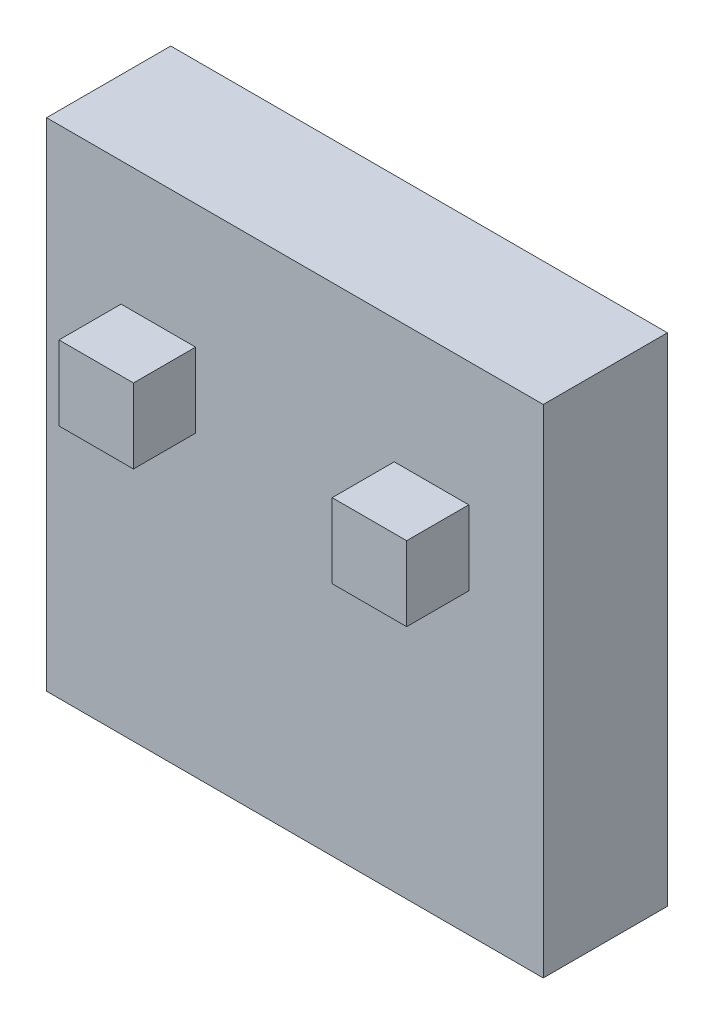
ISO-10303-21;
HEADER;
FILE_DESCRIPTION(('STEP AP214'),'2;1');
FILE_NAME('part.step','',(''),(''),'','','');
FILE_SCHEMA(('AUTOMOTIVE_DESIGN { 1 0 10303 214 1 1 1 1 }'));
ENDSEC;
DATA;
#1=APPLICATION_CONTEXT('core data for automotive mechanical design processes');
#2=APPLICATION_PROTOCOL_DEFINITION('international standard','automotive_design',2000,#1);
#3=PRODUCT_CONTEXT('',#1,'mechanical');
#4=PRODUCT('Part','Part','',(#3));
#5=PRODUCT_RELATED_PRODUCT_CATEGORY('part','',(#4));
#6=PRODUCT_DEFINITION_FORMATION('','',#4);
#7=PRODUCT_DEFINITION_CONTEXT('part definition',#1,'design');
#8=PRODUCT_DEFINITION('design','',#6,#7);
#9=PRODUCT_DEFINITION_SHAPE('','',#8);
#10=(LENGTH_UNIT() NAMED_UNIT(*) SI_UNIT(.MILLI.,.METRE.));
#11=(NAMED_UNIT(*) PLANE_ANGLE_UNIT() SI_UNIT($,.RADIAN.));
#12=(NAMED_UNIT(*) SI_UNIT($,.STERADIAN.) SOLID_ANGLE_UNIT());
#13=UNCERTAINTY_MEASURE_WITH_UNIT(LENGTH_MEASURE(1.E-05),#10,'distance_accuracy_value','');
#14=(GEOMETRIC_REPRESENTATION_CONTEXT(3) GLOBAL_UNCERTAINTY_ASSIGNED_CONTEXT((#13)) GLOBAL_UNIT_ASSIGNED_CONTEXT((#10,
#11,#12)) REPRESENTATION_CONTEXT('',''));
#15=CARTESIAN_POINT('',(0.,0.,0.));
#16=DIRECTION('',(0.,0.,1.));
#17=DIRECTION('',(1.,0.,0.));
#18=AXIS2_PLACEMENT_3D('',#15,#16,#17);
#19=CARTESIAN_POINT('',(0.,0.,10.));
#20=DIRECTION('',(0.,0.,-1.));
#21=DIRECTION('',(-1.,0.,0.));
#22=AXIS2_PLACEMENT_3D('',#19,#20,#21);
#23=PLANE('',#22);
#24=DIRECTION('',(1.,0.,0.));
#25=VECTOR('',#24,1.);
#26=CARTESIAN_POINT('',(14.,30.,10.));
#27=LINE('',#26,#25);
#28=CARTESIAN_POINT('',(8.,30.,10.));
#29=VERTEX_POINT('',#28);
#30=CARTESIAN_POINT('',(14.,30.,10.));
#31=VERTEX_POINT('',#30);
#32=EDGE_CURVE('E203',#29,#31,#27,.T.);
#33=ORIENTED_EDGE('',*,*,#32,.T.);
#34=DIRECTION('',(0.,-1.,0.));
#35=VECTOR('',#34,1.);
#36=CARTESIAN_POINT('',(14.,24.,10.));
#37=LINE('',#36,#35);
#38=CARTESIAN_POINT('',(14.,24.,10.));
#39=VERTEX_POINT('',#38);
#40=EDGE_CURVE('E178',#31,#39,#37,.T.);
#41=ORIENTED_EDGE('',*,*,#40,.T.);
#42=DIRECTION('',(-1.,0.,0.));
#43=VECTOR('',#42,1.);
#44=CARTESIAN_POINT('',(14.,24.,10.));
#45=LINE('',#44,#43);
#46=CARTESIAN_POINT('',(8.,24.,10.));
#47=VERTEX_POINT('',#46);
#48=EDGE_CURVE('E193',#39,#47,#45,.T.);
#49=ORIENTED_EDGE('',*,*,#48,.T.);
#50=DIRECTION('',(0.,1.,0.));
#51=VECTOR('',#50,1.);
#52=CARTESIAN_POINT('',(8.,24.,10.));
#53=LINE('',#52,#51);
#54=EDGE_CURVE('E50',#47,#29,#53,.T.);
#55=ORIENTED_EDGE('',*,*,#54,.T.);
#56=EDGE_LOOP('',(#33,#41,#49,#55));
#57=FACE_BOUND('',#56,.T.);
#58=DIRECTION('',(0.,-1.,0.));
#59=VECTOR('',#58,1.);
#60=CARTESIAN_POINT('',(-20.,0.,10.));
#61=LINE('',#60,#59);
#62=CARTESIAN_POINT('',(-20.,40.,10.));
#63=VERTEX_POINT('',#62);
#64=CARTESIAN_POINT('',(-20.,0.,10.));
#65=VERTEX_POINT('',#64);
#66=EDGE_CURVE('E307',#63,#65,#61,.T.);
#67=ORIENTED_EDGE('',*,*,#66,.T.);
#68=DIRECTION('',(1.,0.,0.));
#69=VECTOR('',#68,1.);
#70=CARTESIAN_POINT('',(-20.,0.,10.));
#71=LINE('',#70,#69);
#72=CARTESIAN_POINT('',(20.,0.,10.));
#73=VERTEX_POINT('',#72);
#74=EDGE_CURVE('E310',#65,#73,#71,.T.);
#75=ORIENTED_EDGE('',*,*,#74,.T.);
#76=DIRECTION('',(0.,1.,0.));
#77=VECTOR('',#76,1.);
#78=CARTESIAN_POINT('',(20.,0.,10.));
#79=LINE('',#78,#77);
#80=CARTESIAN_POINT('',(20.,40.,10.));
#81=VERTEX_POINT('',#80);
#82=EDGE_CURVE('E313',#73,#81,#79,.T.);
#83=ORIENTED_EDGE('',*,*,#82,.T.);
#84=DIRECTION('',(-1.,0.,0.));
#85=VECTOR('',#84,1.);
#86=CARTESIAN_POINT('',(-20.,40.,10.));
#87=LINE('',#86,#85);
#88=EDGE_CURVE('E315',#81,#63,#87,.T.);
#89=ORIENTED_EDGE('',*,*,#88,.T.);
#90=EDGE_LOOP('',(#67,#75,#83,#89));
#91=FACE_BOUND('',#90,.T.);
#92=DIRECTION('',(0.,-1.,0.));
#93=VECTOR('',#92,1.);
#94=CARTESIAN_POINT('',(-14.,24.,10.));
#95=LINE('',#94,#93);
#96=CARTESIAN_POINT('',(-14.,30.,10.));
#97=VERTEX_POINT('',#96);
#98=CARTESIAN_POINT('',(-14.,24.,10.));
#99=VERTEX_POINT('',#98);
#100=EDGE_CURVE('E242',#97,#99,#95,.T.);
#101=ORIENTED_EDGE('',*,*,#100,.F.);
#102=DIRECTION('',(-1.,0.,0.));
#103=VECTOR('',#102,1.);
#104=CARTESIAN_POINT('',(-14.,30.,10.));
#105=LINE('',#104,#103);
#106=CARTESIAN_POINT('',(-8.,30.,10.));
#107=VERTEX_POINT('',#106);
#108=EDGE_CURVE('E247',#107,#97,#105,.T.);
#109=ORIENTED_EDGE('',*,*,#108,.F.);
#110=DIRECTION('',(0.,1.,0.));
#111=VECTOR('',#110,1.);
#112=CARTESIAN_POINT('',(-8.,24.,10.));
#113=LINE('',#112,#111);
#114=CARTESIAN_POINT('',(-8.,24.,10.));
#115=VERTEX_POINT('',#114);
#116=EDGE_CURVE('E259',#115,#107,#113,.T.);
#117=ORIENTED_EDGE('',*,*,#116,.F.);
#118=DIRECTION('',(1.,0.,0.));
#119=VECTOR('',#118,1.);
#120=CARTESIAN_POINT('',(-14.,24.,10.));
#121=LINE('',#120,#119);
#122=EDGE_CURVE('E256',#99,#115,#121,.T.);
#123=ORIENTED_EDGE('',*,*,#122,.F.);
#124=EDGE_LOOP('',(#101,#109,#117,#123));
#125=FACE_BOUND('',#124,.T.);
#126=ADVANCED_FACE('F35',(#57,#91,#125),#23,.F.);
#127=CARTESIAN_POINT('',(0.,0.,0.));
#128=DIRECTION('',(0.,0.,-1.));
#129=DIRECTION('',(-1.,0.,0.));
#130=AXIS2_PLACEMENT_3D('',#127,#128,#129);
#131=PLANE('',#130);
#132=DIRECTION('',(0.,-1.,0.));
#133=VECTOR('',#132,1.);
#134=CARTESIAN_POINT('',(14.,8.,0.));
#135=LINE('',#134,#133);
#136=CARTESIAN_POINT('',(14.,14.,0.));
#137=VERTEX_POINT('',#136);
#138=CARTESIAN_POINT('',(14.,8.,0.));
#139=VERTEX_POINT('',#138);
#140=EDGE_CURVE('E58',#137,#139,#135,.T.);
#141=ORIENTED_EDGE('',*,*,#140,.F.);
#142=DIRECTION('',(1.,0.,0.));
#143=VECTOR('',#142,1.);
#144=CARTESIAN_POINT('',(14.,14.,0.));
#145=LINE('',#144,#143);
#146=CARTESIAN_POINT('',(8.,14.,0.));
#147=VERTEX_POINT('',#146);
#148=EDGE_CURVE('E227',#147,#137,#145,.T.);
#149=ORIENTED_EDGE('',*,*,#148,.F.);
#150=DIRECTION('',(0.,1.,0.));
#151=VECTOR('',#150,1.);
#152=CARTESIAN_POINT('',(8.,8.,0.));
#153=LINE('',#152,#151);
#154=CARTESIAN_POINT('',(8.,8.,0.));
#155=VERTEX_POINT('',#154);
#156=EDGE_CURVE('E230',#155,#147,#153,.T.);
#157=ORIENTED_EDGE('',*,*,#156,.F.);
#158=DIRECTION('',(-1.,0.,0.));
#159=VECTOR('',#158,1.);
#160=CARTESIAN_POINT('',(14.,8.,0.));
#161=LINE('',#160,#159);
#162=EDGE_CURVE('E216',#139,#155,#161,.T.);
#163=ORIENTED_EDGE('',*,*,#162,.F.);
#164=EDGE_LOOP('',(#141,#149,#157,#163));
#165=FACE_BOUND('',#164,.T.);
#166=DIRECTION('',(0.,-1.,0.));
#167=VECTOR('',#166,1.);
#168=CARTESIAN_POINT('',(-20.,0.,0.));
#169=LINE('',#168,#167);
#170=CARTESIAN_POINT('',(-20.,40.,0.));
#171=VERTEX_POINT('',#170);
#172=CARTESIAN_POINT('',(-20.,0.,0.));
#173=VERTEX_POINT('',#172);
#174=EDGE_CURVE('E306',#171,#173,#169,.T.);
#175=ORIENTED_EDGE('',*,*,#174,.F.);
#176=DIRECTION('',(-1.,0.,0.));
#177=VECTOR('',#176,1.);
#178=CARTESIAN_POINT('',(-20.,40.,0.));
#179=LINE('',#178,#177);
#180=CARTESIAN_POINT('',(20.,40.,0.));
#181=VERTEX_POINT('',#180);
#182=EDGE_CURVE('E311',#181,#171,#179,.T.);
#183=ORIENTED_EDGE('',*,*,#182,.F.);
#184=DIRECTION('',(0.,1.,0.));
#185=VECTOR('',#184,1.);
#186=CARTESIAN_POINT('',(20.,0.,0.));
#187=LINE('',#186,#185);
#188=CARTESIAN_POINT('',(20.,0.,0.));
#189=VERTEX_POINT('',#188);
#190=EDGE_CURVE('E322',#189,#181,#187,.T.);
#191=ORIENTED_EDGE('',*,*,#190,.F.);
#192=DIRECTION('',(1.,0.,0.));
#193=VECTOR('',#192,1.);
#194=CARTESIAN_POINT('',(-20.,0.,0.));
#195=LINE('',#194,#193);
#196=EDGE_CURVE('E320',#173,#189,#195,.T.);
#197=ORIENTED_EDGE('',*,*,#196,.F.);
#198=EDGE_LOOP('',(#175,#183,#191,#197));
#199=FACE_BOUND('',#198,.T.);
#200=DIRECTION('',(-1.,0.,0.));
#201=VECTOR('',#200,1.);
#202=CARTESIAN_POINT('',(-14.,14.,0.));
#203=LINE('',#202,#201);
#204=CARTESIAN_POINT('',(-8.,14.,0.));
#205=VERTEX_POINT('',#204);
#206=CARTESIAN_POINT('',(-14.,14.,0.));
#207=VERTEX_POINT('',#206);
#208=EDGE_CURVE('E280',#205,#207,#203,.T.);
#209=ORIENTED_EDGE('',*,*,#208,.T.);
#210=DIRECTION('',(0.,-1.,0.));
#211=VECTOR('',#210,1.);
#212=CARTESIAN_POINT('',(-14.,8.,0.));
#213=LINE('',#212,#211);
#214=CARTESIAN_POINT('',(-14.,8.,0.));
#215=VERTEX_POINT('',#214);
#216=EDGE_CURVE('E275',#207,#215,#213,.T.);
#217=ORIENTED_EDGE('',*,*,#216,.T.);
#218=DIRECTION('',(1.,0.,0.));
#219=VECTOR('',#218,1.);
#220=CARTESIAN_POINT('',(-14.,8.,0.));
#221=LINE('',#220,#219);
#222=CARTESIAN_POINT('',(-8.,8.,0.));
#223=VERTEX_POINT('',#222);
#224=EDGE_CURVE('E289',#215,#223,#221,.T.);
#225=ORIENTED_EDGE('',*,*,#224,.T.);
#226=DIRECTION('',(0.,1.,0.));
#227=VECTOR('',#226,1.);
#228=CARTESIAN_POINT('',(-8.,8.,0.));
#229=LINE('',#228,#227);
#230=EDGE_CURVE('E292',#223,#205,#229,.T.);
#231=ORIENTED_EDGE('',*,*,#230,.T.);
#232=EDGE_LOOP('',(#209,#217,#225,#231));
#233=FACE_BOUND('',#232,.T.);
#234=ADVANCED_FACE('F340',(#165,#199,#233),#131,.T.);
#235=CARTESIAN_POINT('',(-20.,0.,10.));
#236=DIRECTION('',(1.,0.,0.));
#237=DIRECTION('',(0.,0.,-1.));
#238=AXIS2_PLACEMENT_3D('',#235,#236,#237);
#239=PLANE('',#238);
#240=ORIENTED_EDGE('',*,*,#174,.T.);
#241=DIRECTION('',(0.,0.,-1.));
#242=VECTOR('',#241,1.);
#243=CARTESIAN_POINT('',(-20.,0.,10.));
#244=LINE('',#243,#242);
#245=EDGE_CURVE('E11',#65,#173,#244,.T.);
#246=ORIENTED_EDGE('',*,*,#245,.F.);
#247=ORIENTED_EDGE('',*,*,#66,.F.);
#248=DIRECTION('',(0.,0.,-1.));
#249=VECTOR('',#248,1.);
#250=CARTESIAN_POINT('',(-20.,40.,10.));
#251=LINE('',#250,#249);
#252=EDGE_CURVE('E317',#63,#171,#251,.T.);
#253=ORIENTED_EDGE('',*,*,#252,.T.);
#254=EDGE_LOOP('',(#240,#246,#247,#253));
#255=FACE_BOUND('',#254,.T.);
#256=ADVANCED_FACE('F37',(#255),#239,.F.);
#257=CARTESIAN_POINT('',(-20.,0.,10.));
#258=DIRECTION('',(0.,1.,0.));
#259=DIRECTION('',(0.,0.,1.));
#260=AXIS2_PLACEMENT_3D('',#257,#258,#259);
#261=PLANE('',#260);
#262=ORIENTED_EDGE('',*,*,#196,.T.);
#263=DIRECTION('',(0.,0.,-1.));
#264=VECTOR('',#263,1.);
#265=CARTESIAN_POINT('',(20.,0.,10.));
#266=LINE('',#265,#264);
#267=EDGE_CURVE('E43',#73,#189,#266,.T.);
#268=ORIENTED_EDGE('',*,*,#267,.F.);
#269=ORIENTED_EDGE('',*,*,#74,.F.);
#270=ORIENTED_EDGE('',*,*,#245,.T.);
#271=EDGE_LOOP('',(#262,#268,#269,#270));
#272=FACE_BOUND('',#271,.T.);
#273=ADVANCED_FACE('F351',(#272),#261,.F.);
#274=CARTESIAN_POINT('',(20.,0.,10.));
#275=DIRECTION('',(-1.,0.,0.));
#276=DIRECTION('',(0.,0.,1.));
#277=AXIS2_PLACEMENT_3D('',#274,#275,#276);
#278=PLANE('',#277);
#279=ORIENTED_EDGE('',*,*,#190,.T.);
#280=DIRECTION('',(0.,0.,-1.));
#281=VECTOR('',#280,1.);
#282=CARTESIAN_POINT('',(20.,40.,10.));
#283=LINE('',#282,#281);
#284=EDGE_CURVE('E327',#81,#181,#283,.T.);
#285=ORIENTED_EDGE('',*,*,#284,.F.);
#286=ORIENTED_EDGE('',*,*,#82,.F.);
#287=ORIENTED_EDGE('',*,*,#267,.T.);
#288=EDGE_LOOP('',(#279,#285,#286,#287));
#289=FACE_BOUND('',#288,.T.);
#290=ADVANCED_FACE('F334',(#289),#278,.F.);
#291=CARTESIAN_POINT('',(-20.,40.,10.));
#292=DIRECTION('',(0.,-1.,0.));
#293=DIRECTION('',(0.,0.,-1.));
#294=AXIS2_PLACEMENT_3D('',#291,#292,#293);
#295=PLANE('',#294);
#296=ORIENTED_EDGE('',*,*,#182,.T.);
#297=ORIENTED_EDGE('',*,*,#252,.F.);
#298=ORIENTED_EDGE('',*,*,#88,.F.);
#299=ORIENTED_EDGE('',*,*,#284,.T.);
#300=EDGE_LOOP('',(#296,#297,#298,#299));
#301=FACE_BOUND('',#300,.T.);
#302=ADVANCED_FACE('F344',(#301),#295,.F.);
#303=CARTESIAN_POINT('',(-14.,8.,5.));
#304=DIRECTION('',(1.,0.,0.));
#305=DIRECTION('',(0.,0.,-1.));
#306=AXIS2_PLACEMENT_3D('',#303,#304,#305);
#307=PLANE('',#306);
#308=ORIENTED_EDGE('',*,*,#216,.F.);
#309=DIRECTION('',(0.,0.,-1.));
#310=VECTOR('',#309,1.);
#311=CARTESIAN_POINT('',(-14.,14.,5.));
#312=LINE('',#311,#310);
#313=CARTESIAN_POINT('',(-14.,14.,5.));
#314=VERTEX_POINT('',#313);
#315=EDGE_CURVE('E286',#314,#207,#312,.T.);
#316=ORIENTED_EDGE('',*,*,#315,.F.);
#317=DIRECTION('',(0.,-1.,0.));
#318=VECTOR('',#317,1.);
#319=CARTESIAN_POINT('',(-14.,8.,5.));
#320=LINE('',#319,#318);
#321=CARTESIAN_POINT('',(-14.,8.,5.));
#322=VERTEX_POINT('',#321);
#323=EDGE_CURVE('E276',#314,#322,#320,.T.);
#324=ORIENTED_EDGE('',*,*,#323,.T.);
#325=DIRECTION('',(0.,0.,-1.));
#326=VECTOR('',#325,1.);
#327=CARTESIAN_POINT('',(-14.,8.,5.));
#328=LINE('',#327,#326);
#329=EDGE_CURVE('E303',#322,#215,#328,.T.);
#330=ORIENTED_EDGE('',*,*,#329,.T.);
#331=EDGE_LOOP('',(#308,#316,#324,#330));
#332=FACE_BOUND('',#331,.T.);
#333=ADVANCED_FACE('F367',(#332),#307,.T.);
#334=CARTESIAN_POINT('',(-14.,8.,5.));
#335=DIRECTION('',(0.,1.,0.));
#336=DIRECTION('',(0.,0.,1.));
#337=AXIS2_PLACEMENT_3D('',#334,#335,#336);
#338=PLANE('',#337);
#339=ORIENTED_EDGE('',*,*,#224,.F.);
#340=ORIENTED_EDGE('',*,*,#329,.F.);
#341=DIRECTION('',(1.,0.,0.));
#342=VECTOR('',#341,1.);
#343=CARTESIAN_POINT('',(-14.,8.,5.));
#344=LINE('',#343,#342);
#345=CARTESIAN_POINT('',(-8.,8.,5.));
#346=VERTEX_POINT('',#345);
#347=EDGE_CURVE('E279',#322,#346,#344,.T.);
#348=ORIENTED_EDGE('',*,*,#347,.T.);
#349=DIRECTION('',(0.,0.,-1.));
#350=VECTOR('',#349,1.);
#351=CARTESIAN_POINT('',(-8.,8.,5.));
#352=LINE('',#351,#350);
#353=EDGE_CURVE('E301',#346,#223,#352,.T.);
#354=ORIENTED_EDGE('',*,*,#353,.T.);
#355=EDGE_LOOP('',(#339,#340,#348,#354));
#356=FACE_BOUND('',#355,.T.);
#357=ADVANCED_FACE('F374',(#356),#338,.T.);
#358=CARTESIAN_POINT('',(-8.,8.,5.));
#359=DIRECTION('',(-1.,0.,0.));
#360=DIRECTION('',(0.,0.,1.));
#361=AXIS2_PLACEMENT_3D('',#358,#359,#360);
#362=PLANE('',#361);
#363=ORIENTED_EDGE('',*,*,#230,.F.);
#364=ORIENTED_EDGE('',*,*,#353,.F.);
#365=DIRECTION('',(0.,1.,0.));
#366=VECTOR('',#365,1.);
#367=CARTESIAN_POINT('',(-8.,8.,5.));
#368=LINE('',#367,#366);
#369=CARTESIAN_POINT('',(-8.,14.,5.));
#370=VERTEX_POINT('',#369);
#371=EDGE_CURVE('E282',#346,#370,#368,.T.);
#372=ORIENTED_EDGE('',*,*,#371,.T.);
#373=DIRECTION('',(0.,0.,-1.));
#374=VECTOR('',#373,1.);
#375=CARTESIAN_POINT('',(-8.,14.,5.));
#376=LINE('',#375,#374);
#377=EDGE_CURVE('E299',#370,#205,#376,.T.);
#378=ORIENTED_EDGE('',*,*,#377,.T.);
#379=EDGE_LOOP('',(#363,#364,#372,#378));
#380=FACE_BOUND('',#379,.T.);
#381=ADVANCED_FACE('F379',(#380),#362,.T.);
#382=CARTESIAN_POINT('',(-14.,14.,5.));
#383=DIRECTION('',(0.,-1.,0.));
#384=DIRECTION('',(0.,0.,-1.));
#385=AXIS2_PLACEMENT_3D('',#382,#383,#384);
#386=PLANE('',#385);
#387=ORIENTED_EDGE('',*,*,#208,.F.);
#388=ORIENTED_EDGE('',*,*,#377,.F.);
#389=DIRECTION('',(-1.,0.,0.));
#390=VECTOR('',#389,1.);
#391=CARTESIAN_POINT('',(-14.,14.,5.));
#392=LINE('',#391,#390);
#393=EDGE_CURVE('E284',#370,#314,#392,.T.);
#394=ORIENTED_EDGE('',*,*,#393,.T.);
#395=ORIENTED_EDGE('',*,*,#315,.T.);
#396=EDGE_LOOP('',(#387,#388,#394,#395));
#397=FACE_BOUND('',#396,.T.);
#398=ADVANCED_FACE('F386',(#397),#386,.T.);
#399=CARTESIAN_POINT('',(0.,0.,5.));
#400=DIRECTION('',(0.,0.,-1.));
#401=DIRECTION('',(-1.,0.,0.));
#402=AXIS2_PLACEMENT_3D('',#399,#400,#401);
#403=PLANE('',#402);
#404=ORIENTED_EDGE('',*,*,#323,.F.);
#405=ORIENTED_EDGE('',*,*,#393,.F.);
#406=ORIENTED_EDGE('',*,*,#371,.F.);
#407=ORIENTED_EDGE('',*,*,#347,.F.);
#408=EDGE_LOOP('',(#404,#405,#406,#407));
#409=FACE_BOUND('',#408,.T.);
#410=ADVANCED_FACE('F394',(#409),#403,.T.);
#411=CARTESIAN_POINT('',(-14.,24.,15.));
#412=DIRECTION('',(1.,0.,0.));
#413=DIRECTION('',(0.,0.,-1.));
#414=AXIS2_PLACEMENT_3D('',#411,#412,#413);
#415=PLANE('',#414);
#416=ORIENTED_EDGE('',*,*,#100,.T.);
#417=DIRECTION('',(0.,0.,-1.));
#418=VECTOR('',#417,1.);
#419=CARTESIAN_POINT('',(-14.,24.,15.));
#420=LINE('',#419,#418);
#421=CARTESIAN_POINT('',(-14.,24.,15.));
#422=VERTEX_POINT('',#421);
#423=EDGE_CURVE('E272',#422,#99,#420,.T.);
#424=ORIENTED_EDGE('',*,*,#423,.F.);
#425=DIRECTION('',(0.,-1.,0.));
#426=VECTOR('',#425,1.);
#427=CARTESIAN_POINT('',(-14.,24.,15.));
#428=LINE('',#427,#426);
#429=CARTESIAN_POINT('',(-14.,30.,15.));
#430=VERTEX_POINT('',#429);
#431=EDGE_CURVE('E243',#430,#422,#428,.T.);
#432=ORIENTED_EDGE('',*,*,#431,.F.);
#433=DIRECTION('',(0.,0.,-1.));
#434=VECTOR('',#433,1.);
#435=CARTESIAN_POINT('',(-14.,30.,15.));
#436=LINE('',#435,#434);
#437=EDGE_CURVE('E253',#430,#97,#436,.T.);
#438=ORIENTED_EDGE('',*,*,#437,.T.);
#439=EDGE_LOOP('',(#416,#424,#432,#438));
#440=FACE_BOUND('',#439,.T.);
#441=ADVANCED_FACE('F396',(#440),#415,.F.);
#442=CARTESIAN_POINT('',(-14.,24.,15.));
#443=DIRECTION('',(0.,1.,0.));
#444=DIRECTION('',(0.,0.,1.));
#445=AXIS2_PLACEMENT_3D('',#442,#443,#444);
#446=PLANE('',#445);
#447=ORIENTED_EDGE('',*,*,#122,.T.);
#448=DIRECTION('',(0.,0.,-1.));
#449=VECTOR('',#448,1.);
#450=CARTESIAN_POINT('',(-8.,24.,15.));
#451=LINE('',#450,#449);
#452=CARTESIAN_POINT('',(-8.,24.,15.));
#453=VERTEX_POINT('',#452);
#454=EDGE_CURVE('E269',#453,#115,#451,.T.);
#455=ORIENTED_EDGE('',*,*,#454,.F.);
#456=DIRECTION('',(1.,0.,0.));
#457=VECTOR('',#456,1.);
#458=CARTESIAN_POINT('',(-14.,24.,15.));
#459=LINE('',#458,#457);
#460=EDGE_CURVE('E246',#422,#453,#459,.T.);
#461=ORIENTED_EDGE('',*,*,#460,.F.);
#462=ORIENTED_EDGE('',*,*,#423,.T.);
#463=EDGE_LOOP('',(#447,#455,#461,#462));
#464=FACE_BOUND('',#463,.T.);
#465=ADVANCED_FACE('F402',(#464),#446,.F.);
#466=CARTESIAN_POINT('',(-8.,24.,15.));
#467=DIRECTION('',(-1.,0.,0.));
#468=DIRECTION('',(0.,0.,1.));
#469=AXIS2_PLACEMENT_3D('',#466,#467,#468);
#470=PLANE('',#469);
#471=ORIENTED_EDGE('',*,*,#116,.T.);
#472=DIRECTION('',(0.,0.,-1.));
#473=VECTOR('',#472,1.);
#474=CARTESIAN_POINT('',(-8.,30.,15.));
#475=LINE('',#474,#473);
#476=CARTESIAN_POINT('',(-8.,30.,15.));
#477=VERTEX_POINT('',#476);
#478=EDGE_CURVE('E266',#477,#107,#475,.T.);
#479=ORIENTED_EDGE('',*,*,#478,.F.);
#480=DIRECTION('',(0.,1.,0.));
#481=VECTOR('',#480,1.);
#482=CARTESIAN_POINT('',(-8.,24.,15.));
#483=LINE('',#482,#481);
#484=EDGE_CURVE('E249',#453,#477,#483,.T.);
#485=ORIENTED_EDGE('',*,*,#484,.F.);
#486=ORIENTED_EDGE('',*,*,#454,.T.);
#487=EDGE_LOOP('',(#471,#479,#485,#486));
#488=FACE_BOUND('',#487,.T.);
#489=ADVANCED_FACE('F437',(#488),#470,.F.);
#490=CARTESIAN_POINT('',(-14.,30.,15.));
#491=DIRECTION('',(0.,-1.,0.));
#492=DIRECTION('',(0.,0.,-1.));
#493=AXIS2_PLACEMENT_3D('',#490,#491,#492);
#494=PLANE('',#493);
#495=ORIENTED_EDGE('',*,*,#108,.T.);
#496=ORIENTED_EDGE('',*,*,#437,.F.);
#497=DIRECTION('',(-1.,0.,0.));
#498=VECTOR('',#497,1.);
#499=CARTESIAN_POINT('',(-14.,30.,15.));
#500=LINE('',#499,#498);
#501=EDGE_CURVE('E251',#477,#430,#500,.T.);
#502=ORIENTED_EDGE('',*,*,#501,.F.);
#503=ORIENTED_EDGE('',*,*,#478,.T.);
#504=EDGE_LOOP('',(#495,#496,#502,#503));
#505=FACE_BOUND('',#504,.T.);
#506=ADVANCED_FACE('F446',(#505),#494,.F.);
#507=CARTESIAN_POINT('',(0.,0.,15.));
#508=DIRECTION('',(0.,0.,-1.));
#509=DIRECTION('',(-1.,0.,0.));
#510=AXIS2_PLACEMENT_3D('',#507,#508,#509);
#511=PLANE('',#510);
#512=ORIENTED_EDGE('',*,*,#431,.T.);
#513=ORIENTED_EDGE('',*,*,#460,.T.);
#514=ORIENTED_EDGE('',*,*,#484,.T.);
#515=ORIENTED_EDGE('',*,*,#501,.T.);
#516=EDGE_LOOP('',(#512,#513,#514,#515));
#517=FACE_BOUND('',#516,.T.);
#518=ADVANCED_FACE('F456',(#517),#511,.F.);
#519=CARTESIAN_POINT('',(14.,8.,5.));
#520=DIRECTION('',(1.,0.,0.));
#521=DIRECTION('',(0.,0.,-1.));
#522=AXIS2_PLACEMENT_3D('',#519,#520,#521);
#523=PLANE('',#522);
#524=ORIENTED_EDGE('',*,*,#140,.T.);
#525=DIRECTION('',(0.,0.,-1.));
#526=VECTOR('',#525,1.);
#527=CARTESIAN_POINT('',(14.,8.,5.));
#528=LINE('',#527,#526);
#529=CARTESIAN_POINT('',(14.,8.,5.));
#530=VERTEX_POINT('',#529);
#531=EDGE_CURVE('E225',#530,#139,#528,.T.);
#532=ORIENTED_EDGE('',*,*,#531,.F.);
#533=DIRECTION('',(0.,-1.,0.));
#534=VECTOR('',#533,1.);
#535=CARTESIAN_POINT('',(14.,8.,5.));
#536=LINE('',#535,#534);
#537=CARTESIAN_POINT('',(14.,14.,5.));
#538=VERTEX_POINT('',#537);
#539=EDGE_CURVE('E212',#538,#530,#536,.T.);
#540=ORIENTED_EDGE('',*,*,#539,.F.);
#541=DIRECTION('',(0.,0.,-1.));
#542=VECTOR('',#541,1.);
#543=CARTESIAN_POINT('',(14.,14.,5.));
#544=LINE('',#543,#542);
#545=EDGE_CURVE('E240',#538,#137,#544,.T.);
#546=ORIENTED_EDGE('',*,*,#545,.T.);
#547=EDGE_LOOP('',(#524,#532,#540,#546));
#548=FACE_BOUND('',#547,.T.);
#549=ADVANCED_FACE('F465',(#548),#523,.F.);
#550=CARTESIAN_POINT('',(14.,14.,5.));
#551=DIRECTION('',(0.,1.,0.));
#552=DIRECTION('',(0.,0.,1.));
#553=AXIS2_PLACEMENT_3D('',#550,#551,#552);
#554=PLANE('',#553);
#555=ORIENTED_EDGE('',*,*,#148,.T.);
#556=ORIENTED_EDGE('',*,*,#545,.F.);
#557=DIRECTION('',(1.,0.,0.));
#558=VECTOR('',#557,1.);
#559=CARTESIAN_POINT('',(14.,14.,5.));
#560=LINE('',#559,#558);
#561=CARTESIAN_POINT('',(8.,14.,5.));
#562=VERTEX_POINT('',#561);
#563=EDGE_CURVE('E215',#562,#538,#560,.T.);
#564=ORIENTED_EDGE('',*,*,#563,.F.);
#565=DIRECTION('',(0.,0.,-1.));
#566=VECTOR('',#565,1.);
#567=CARTESIAN_POINT('',(8.,14.,5.));
#568=LINE('',#567,#566);
#569=EDGE_CURVE('E238',#562,#147,#568,.T.);
#570=ORIENTED_EDGE('',*,*,#569,.T.);
#571=EDGE_LOOP('',(#555,#556,#564,#570));
#572=FACE_BOUND('',#571,.T.);
#573=ADVANCED_FACE('F487',(#572),#554,.F.);
#574=CARTESIAN_POINT('',(8.,8.,5.));
#575=DIRECTION('',(-1.,0.,0.));
#576=DIRECTION('',(0.,0.,1.));
#577=AXIS2_PLACEMENT_3D('',#574,#575,#576);
#578=PLANE('',#577);
#579=ORIENTED_EDGE('',*,*,#156,.T.);
#580=ORIENTED_EDGE('',*,*,#569,.F.);
#581=DIRECTION('',(0.,1.,0.));
#582=VECTOR('',#581,1.);
#583=CARTESIAN_POINT('',(8.,8.,5.));
#584=LINE('',#583,#582);
#585=CARTESIAN_POINT('',(8.,8.,5.));
#586=VERTEX_POINT('',#585);
#587=EDGE_CURVE('E219',#586,#562,#584,.T.);
#588=ORIENTED_EDGE('',*,*,#587,.F.);
#589=DIRECTION('',(0.,0.,-1.));
#590=VECTOR('',#589,1.);
#591=CARTESIAN_POINT('',(8.,8.,5.));
#592=LINE('',#591,#590);
#593=EDGE_CURVE('E236',#586,#155,#592,.T.);
#594=ORIENTED_EDGE('',*,*,#593,.T.);
#595=EDGE_LOOP('',(#579,#580,#588,#594));
#596=FACE_BOUND('',#595,.T.);
#597=ADVANCED_FACE('F496',(#596),#578,.F.);
#598=CARTESIAN_POINT('',(14.,8.,5.));
#599=DIRECTION('',(0.,-1.,0.));
#600=DIRECTION('',(0.,0.,-1.));
#601=AXIS2_PLACEMENT_3D('',#598,#599,#600);
#602=PLANE('',#601);
#603=ORIENTED_EDGE('',*,*,#162,.T.);
#604=ORIENTED_EDGE('',*,*,#593,.F.);
#605=DIRECTION('',(-1.,0.,0.));
#606=VECTOR('',#605,1.);
#607=CARTESIAN_POINT('',(14.,8.,5.));
#608=LINE('',#607,#606);
#609=EDGE_CURVE('E222',#530,#586,#608,.T.);
#610=ORIENTED_EDGE('',*,*,#609,.F.);
#611=ORIENTED_EDGE('',*,*,#531,.T.);
#612=EDGE_LOOP('',(#603,#604,#610,#611));
#613=FACE_BOUND('',#612,.T.);
#614=ADVANCED_FACE('F506',(#613),#602,.F.);
#615=CARTESIAN_POINT('',(0.,0.,5.));
#616=DIRECTION('',(0.,0.,-1.));
#617=DIRECTION('',(1.,0.,0.));
#618=AXIS2_PLACEMENT_3D('',#615,#616,#617);
#619=PLANE('',#618);
#620=ORIENTED_EDGE('',*,*,#539,.T.);
#621=ORIENTED_EDGE('',*,*,#609,.T.);
#622=ORIENTED_EDGE('',*,*,#587,.T.);
#623=ORIENTED_EDGE('',*,*,#563,.T.);
#624=EDGE_LOOP('',(#620,#621,#622,#623));
#625=FACE_BOUND('',#624,.T.);
#626=ADVANCED_FACE('F516',(#625),#619,.T.);
#627=CARTESIAN_POINT('',(14.,24.,15.));
#628=DIRECTION('',(1.,0.,0.));
#629=DIRECTION('',(0.,0.,-1.));
#630=AXIS2_PLACEMENT_3D('',#627,#628,#629);
#631=PLANE('',#630);
#632=ORIENTED_EDGE('',*,*,#40,.F.);
#633=DIRECTION('',(0.,0.,-1.));
#634=VECTOR('',#633,1.);
#635=CARTESIAN_POINT('',(14.,30.,15.));
#636=LINE('',#635,#634);
#637=CARTESIAN_POINT('',(14.,30.,15.));
#638=VERTEX_POINT('',#637);
#639=EDGE_CURVE('E172',#638,#31,#636,.T.);
#640=ORIENTED_EDGE('',*,*,#639,.F.);
#641=DIRECTION('',(0.,-1.,0.));
#642=VECTOR('',#641,1.);
#643=CARTESIAN_POINT('',(14.,24.,15.));
#644=LINE('',#643,#642);
#645=CARTESIAN_POINT('',(14.,24.,15.));
#646=VERTEX_POINT('',#645);
#647=EDGE_CURVE('E175',#638,#646,#644,.T.);
#648=ORIENTED_EDGE('',*,*,#647,.T.);
#649=DIRECTION('',(0.,0.,-1.));
#650=VECTOR('',#649,1.);
#651=CARTESIAN_POINT('',(14.,24.,15.));
#652=LINE('',#651,#650);
#653=EDGE_CURVE('E201',#646,#39,#652,.T.);
#654=ORIENTED_EDGE('',*,*,#653,.T.);
#655=EDGE_LOOP('',(#632,#640,#648,#654));
#656=FACE_BOUND('',#655,.T.);
#657=ADVANCED_FACE('F174',(#656),#631,.T.);
#658=CARTESIAN_POINT('',(14.,30.,15.));
#659=DIRECTION('',(0.,1.,0.));
#660=DIRECTION('',(0.,0.,1.));
#661=AXIS2_PLACEMENT_3D('',#658,#659,#660);
#662=PLANE('',#661);
#663=ORIENTED_EDGE('',*,*,#32,.F.);
#664=DIRECTION('',(0.,0.,-1.));
#665=VECTOR('',#664,1.);
#666=CARTESIAN_POINT('',(8.,30.,15.));
#667=LINE('',#666,#665);
#668=CARTESIAN_POINT('',(8.,30.,15.));
#669=VERTEX_POINT('',#668);
#670=EDGE_CURVE('E183',#669,#29,#667,.T.);
#671=ORIENTED_EDGE('',*,*,#670,.F.);
#672=DIRECTION('',(1.,0.,0.));
#673=VECTOR('',#672,1.);
#674=CARTESIAN_POINT('',(14.,30.,15.));
#675=LINE('',#674,#673);
#676=EDGE_CURVE('E189',#669,#638,#675,.T.);
#677=ORIENTED_EDGE('',*,*,#676,.T.);
#678=ORIENTED_EDGE('',*,*,#639,.T.);
#679=EDGE_LOOP('',(#663,#671,#677,#678));
#680=FACE_BOUND('',#679,.T.);
#681=ADVANCED_FACE('F195',(#680),#662,.T.);
#682=CARTESIAN_POINT('',(8.,24.,15.));
#683=DIRECTION('',(-1.,0.,0.));
#684=DIRECTION('',(0.,0.,1.));
#685=AXIS2_PLACEMENT_3D('',#682,#683,#684);
#686=PLANE('',#685);
#687=ORIENTED_EDGE('',*,*,#54,.F.);
#688=DIRECTION('',(0.,0.,-1.));
#689=VECTOR('',#688,1.);
#690=CARTESIAN_POINT('',(8.,24.,15.));
#691=LINE('',#690,#689);
#692=CARTESIAN_POINT('',(8.,24.,15.));
#693=VERTEX_POINT('',#692);
#694=EDGE_CURVE('E209',#693,#47,#691,.T.);
#695=ORIENTED_EDGE('',*,*,#694,.F.);
#696=DIRECTION('',(0.,1.,0.));
#697=VECTOR('',#696,1.);
#698=CARTESIAN_POINT('',(8.,24.,15.));
#699=LINE('',#698,#697);
#700=EDGE_CURVE('E196',#693,#669,#699,.T.);
#701=ORIENTED_EDGE('',*,*,#700,.T.);
#702=ORIENTED_EDGE('',*,*,#670,.T.);
#703=EDGE_LOOP('',(#687,#695,#701,#702));
#704=FACE_BOUND('',#703,.T.);
#705=ADVANCED_FACE('F543',(#704),#686,.T.);
#706=CARTESIAN_POINT('',(14.,24.,15.));
#707=DIRECTION('',(0.,-1.,0.));
#708=DIRECTION('',(0.,0.,-1.));
#709=AXIS2_PLACEMENT_3D('',#706,#707,#708);
#710=PLANE('',#709);
#711=ORIENTED_EDGE('',*,*,#48,.F.);
#712=ORIENTED_EDGE('',*,*,#653,.F.);
#713=DIRECTION('',(-1.,0.,0.));
#714=VECTOR('',#713,1.);
#715=CARTESIAN_POINT('',(14.,24.,15.));
#716=LINE('',#715,#714);
#717=EDGE_CURVE('E192',#646,#693,#716,.T.);
#718=ORIENTED_EDGE('',*,*,#717,.T.);
#719=ORIENTED_EDGE('',*,*,#694,.T.);
#720=EDGE_LOOP('',(#711,#712,#718,#719));
#721=FACE_BOUND('',#720,.T.);
#722=ADVANCED_FACE('F552',(#721),#710,.T.);
#723=CARTESIAN_POINT('',(0.,0.,15.));
#724=DIRECTION('',(0.,0.,-1.));
#725=DIRECTION('',(1.,0.,0.));
#726=AXIS2_PLACEMENT_3D('',#723,#724,#725);
#727=PLANE('',#726);
#728=ORIENTED_EDGE('',*,*,#647,.F.);
#729=ORIENTED_EDGE('',*,*,#676,.F.);
#730=ORIENTED_EDGE('',*,*,#700,.F.);
#731=ORIENTED_EDGE('',*,*,#717,.F.);
#732=EDGE_LOOP('',(#728,#729,#730,#731));
#733=FACE_BOUND('',#732,.T.);
#734=ADVANCED_FACE('F187',(#733),#727,.F.);
#735=CLOSED_SHELL('',(#126,#234,#256,#273,#290,#302,#333,#357,#381,#398,#410,#441,#465,#489,
#506,#518,#549,#573,#597,#614,#626,#657,#681,#705,#722,#734));
#736=MANIFOLD_SOLID_BREP('B2',#735);
#737=ADVANCED_BREP_SHAPE_REPRESENTATION('',(#18,#736),#14);
#738=SHAPE_DEFINITION_REPRESENTATION(#9,#737);
ENDSEC;
END-ISO-10303-21;
